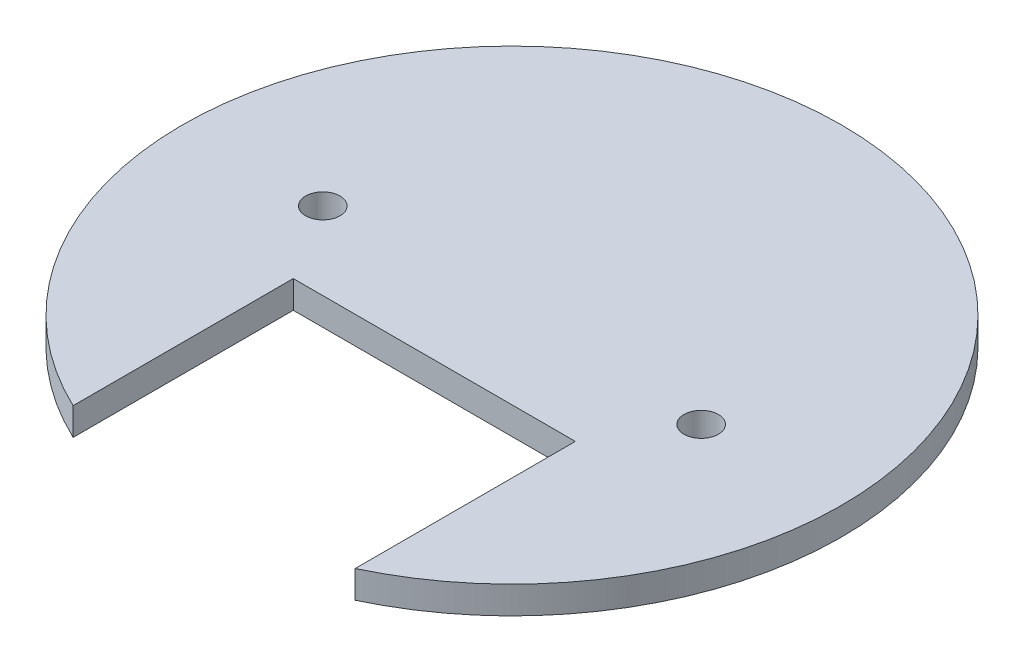
ISO-10303-21;
HEADER;
FILE_DESCRIPTION(('STEP AP214'),'2;1');
FILE_NAME('part.step','',(''),(''),'','','');
FILE_SCHEMA(('AUTOMOTIVE_DESIGN { 1 0 10303 214 1 1 1 1 }'));
ENDSEC;
DATA;
#1=APPLICATION_CONTEXT('core data for automotive mechanical design processes');
#2=APPLICATION_PROTOCOL_DEFINITION('international standard','automotive_design',2000,#1);
#3=PRODUCT_CONTEXT('',#1,'mechanical');
#4=PRODUCT('Part','Part','',(#3));
#5=PRODUCT_RELATED_PRODUCT_CATEGORY('part','',(#4));
#6=PRODUCT_DEFINITION_FORMATION('','',#4);
#7=PRODUCT_DEFINITION_CONTEXT('part definition',#1,'design');
#8=PRODUCT_DEFINITION('design','',#6,#7);
#9=PRODUCT_DEFINITION_SHAPE('','',#8);
#10=(LENGTH_UNIT() NAMED_UNIT(*) SI_UNIT(.MILLI.,.METRE.));
#11=(NAMED_UNIT(*) PLANE_ANGLE_UNIT() SI_UNIT($,.RADIAN.));
#12=(NAMED_UNIT(*) SI_UNIT($,.STERADIAN.) SOLID_ANGLE_UNIT());
#13=UNCERTAINTY_MEASURE_WITH_UNIT(LENGTH_MEASURE(1.E-05),#10,'distance_accuracy_value','');
#14=(GEOMETRIC_REPRESENTATION_CONTEXT(3) GLOBAL_UNCERTAINTY_ASSIGNED_CONTEXT((#13)) GLOBAL_UNIT_ASSIGNED_CONTEXT((#10,
#11,#12)) REPRESENTATION_CONTEXT('',''));
#15=CARTESIAN_POINT('',(0.,0.,0.));
#16=DIRECTION('',(0.,0.,1.));
#17=DIRECTION('',(1.,0.,0.));
#18=AXIS2_PLACEMENT_3D('',#15,#16,#17);
#19=CARTESIAN_POINT('',(0.,4.,0.));
#20=DIRECTION('',(0.,1.,0.));
#21=DIRECTION('',(0.,0.,1.));
#22=AXIS2_PLACEMENT_3D('',#19,#20,#21);
#23=PLANE('',#22);
#24=CARTESIAN_POINT('',(-27.5,4.,0.));
#25=DIRECTION('',(0.,1.,0.));
#26=DIRECTION('',(0.,0.,1.));
#27=AXIS2_PLACEMENT_3D('',#24,#25,#26);
#28=CIRCLE('',#27,2.5);
#29=CARTESIAN_POINT('',(-27.5,4.,2.5));
#30=VERTEX_POINT('',#29);
#31=EDGE_CURVE('E99',#30,#30,#28,.T.);
#32=ORIENTED_EDGE('',*,*,#31,.F.);
#33=EDGE_LOOP('',(#32));
#34=FACE_BOUND('',#33,.T.);
#35=CARTESIAN_POINT('',(0.,4.,0.));
#36=DIRECTION('',(0.,1.,0.));
#37=DIRECTION('',(0.,0.,1.));
#38=AXIS2_PLACEMENT_3D('',#35,#36,#37);
#39=CIRCLE('',#38,47.9);
#40=CARTESIAN_POINT('',(20.5,4.,43.2915696181139));
#41=VERTEX_POINT('',#40);
#42=CARTESIAN_POINT('',(-20.5,4.,43.2915696181139));
#43=VERTEX_POINT('',#42);
#44=EDGE_CURVE('E84',#41,#43,#39,.T.);
#45=ORIENTED_EDGE('',*,*,#44,.T.);
#46=DIRECTION('',(0.,0.,-1.));
#47=VECTOR('',#46,1.);
#48=CARTESIAN_POINT('',(-20.5,4.,43.2915696181139));
#49=LINE('',#48,#47);
#50=CARTESIAN_POINT('',(-20.5,4.,11.2915696181139));
#51=VERTEX_POINT('',#50);
#52=EDGE_CURVE('E79',#43,#51,#49,.T.);
#53=ORIENTED_EDGE('',*,*,#52,.T.);
#54=DIRECTION('',(1.,0.,0.));
#55=VECTOR('',#54,1.);
#56=CARTESIAN_POINT('',(-20.5,4.,11.2915696181139));
#57=LINE('',#56,#55);
#58=CARTESIAN_POINT('',(20.5,4.,11.2915696181139));
#59=VERTEX_POINT('',#58);
#60=EDGE_CURVE('E82',#51,#59,#57,.T.);
#61=ORIENTED_EDGE('',*,*,#60,.T.);
#62=DIRECTION('',(0.,0.,1.));
#63=VECTOR('',#62,1.);
#64=CARTESIAN_POINT('',(20.5,4.,11.2915696181139));
#65=LINE('',#64,#63);
#66=EDGE_CURVE('E49',#59,#41,#65,.T.);
#67=ORIENTED_EDGE('',*,*,#66,.T.);
#68=EDGE_LOOP('',(#45,#53,#61,#67));
#69=FACE_BOUND('',#68,.T.);
#70=CARTESIAN_POINT('',(27.5,4.,0.));
#71=DIRECTION('',(0.,1.,0.));
#72=DIRECTION('',(0.,0.,-1.));
#73=AXIS2_PLACEMENT_3D('',#70,#71,#72);
#74=CIRCLE('',#73,2.5);
#75=CARTESIAN_POINT('',(27.5,4.,-2.50000000000001));
#76=VERTEX_POINT('',#75);
#77=EDGE_CURVE('E114',#76,#76,#74,.T.);
#78=ORIENTED_EDGE('',*,*,#77,.F.);
#79=EDGE_LOOP('',(#78));
#80=FACE_BOUND('',#79,.T.);
#81=ADVANCED_FACE('F32',(#34,#69,#80),#23,.T.);
#82=CARTESIAN_POINT('',(0.,0.,0.));
#83=DIRECTION('',(0.,1.,0.));
#84=DIRECTION('',(0.,0.,1.));
#85=AXIS2_PLACEMENT_3D('',#82,#83,#84);
#86=PLANE('',#85);
#87=CARTESIAN_POINT('',(0.,0.,0.));
#88=DIRECTION('',(0.,1.,0.));
#89=DIRECTION('',(0.,0.,1.));
#90=AXIS2_PLACEMENT_3D('',#87,#88,#89);
#91=CIRCLE('',#90,47.9);
#92=CARTESIAN_POINT('',(20.5,0.,43.2915696181139));
#93=VERTEX_POINT('',#92);
#94=CARTESIAN_POINT('',(-20.5,0.,43.2915696181139));
#95=VERTEX_POINT('',#94);
#96=EDGE_CURVE('E96',#93,#95,#91,.T.);
#97=ORIENTED_EDGE('',*,*,#96,.F.);
#98=DIRECTION('',(0.,0.,1.));
#99=VECTOR('',#98,1.);
#100=CARTESIAN_POINT('',(20.5,0.,11.2915696181139));
#101=LINE('',#100,#99);
#102=CARTESIAN_POINT('',(20.5,0.,11.2915696181139));
#103=VERTEX_POINT('',#102);
#104=EDGE_CURVE('E72',#103,#93,#101,.T.);
#105=ORIENTED_EDGE('',*,*,#104,.F.);
#106=DIRECTION('',(1.,0.,0.));
#107=VECTOR('',#106,1.);
#108=CARTESIAN_POINT('',(-20.5,0.,11.2915696181139));
#109=LINE('',#108,#107);
#110=CARTESIAN_POINT('',(-20.5,0.,11.2915696181139));
#111=VERTEX_POINT('',#110);
#112=EDGE_CURVE('E66',#111,#103,#109,.T.);
#113=ORIENTED_EDGE('',*,*,#112,.F.);
#114=DIRECTION('',(0.,0.,-1.));
#115=VECTOR('',#114,1.);
#116=CARTESIAN_POINT('',(-20.5,0.,43.2915696181139));
#117=LINE('',#116,#115);
#118=EDGE_CURVE('E88',#95,#111,#117,.T.);
#119=ORIENTED_EDGE('',*,*,#118,.F.);
#120=EDGE_LOOP('',(#97,#105,#113,#119));
#121=FACE_BOUND('',#120,.T.);
#122=CARTESIAN_POINT('',(-27.5,0.,0.));
#123=DIRECTION('',(0.,1.,0.));
#124=DIRECTION('',(0.,0.,1.));
#125=AXIS2_PLACEMENT_3D('',#122,#123,#124);
#126=CIRCLE('',#125,2.5);
#127=CARTESIAN_POINT('',(-27.5,0.,2.5));
#128=VERTEX_POINT('',#127);
#129=EDGE_CURVE('E111',#128,#128,#126,.T.);
#130=ORIENTED_EDGE('',*,*,#129,.T.);
#131=EDGE_LOOP('',(#130));
#132=FACE_BOUND('',#131,.T.);
#133=CARTESIAN_POINT('',(27.5,0.,0.));
#134=DIRECTION('',(0.,1.,0.));
#135=DIRECTION('',(0.,0.,-1.));
#136=AXIS2_PLACEMENT_3D('',#133,#134,#135);
#137=CIRCLE('',#136,2.5);
#138=CARTESIAN_POINT('',(27.5,0.,-2.50000000000001));
#139=VERTEX_POINT('',#138);
#140=EDGE_CURVE('E117',#139,#139,#137,.T.);
#141=ORIENTED_EDGE('',*,*,#140,.T.);
#142=EDGE_LOOP('',(#141));
#143=FACE_BOUND('',#142,.T.);
#144=ADVANCED_FACE('F107',(#121,#132,#143),#86,.F.);
#145=CARTESIAN_POINT('',(0.,4.,0.));
#146=DIRECTION('',(0.,-1.,0.));
#147=DIRECTION('',(0.,0.,-1.));
#148=AXIS2_PLACEMENT_3D('',#145,#146,#147);
#149=CYLINDRICAL_SURFACE('',#148,47.9);
#150=ORIENTED_EDGE('',*,*,#96,.T.);
#151=DIRECTION('',(0.,-1.,0.));
#152=VECTOR('',#151,1.);
#153=CARTESIAN_POINT('',(-20.5,4.,43.2915696181139));
#154=LINE('',#153,#152);
#155=EDGE_CURVE('E11',#43,#95,#154,.T.);
#156=ORIENTED_EDGE('',*,*,#155,.F.);
#157=ORIENTED_EDGE('',*,*,#44,.F.);
#158=DIRECTION('',(0.,-1.,0.));
#159=VECTOR('',#158,1.);
#160=CARTESIAN_POINT('',(20.5,4.,43.2915696181139));
#161=LINE('',#160,#159);
#162=EDGE_CURVE('E92',#41,#93,#161,.T.);
#163=ORIENTED_EDGE('',*,*,#162,.T.);
#164=EDGE_LOOP('',(#150,#156,#157,#163));
#165=FACE_BOUND('',#164,.T.);
#166=ADVANCED_FACE('F34',(#165),#149,.T.);
#167=CARTESIAN_POINT('',(-20.5,4.,43.2915696181139));
#168=DIRECTION('',(-1.,0.,0.));
#169=DIRECTION('',(0.,0.,1.));
#170=AXIS2_PLACEMENT_3D('',#167,#168,#169);
#171=PLANE('',#170);
#172=ORIENTED_EDGE('',*,*,#118,.T.);
#173=DIRECTION('',(0.,-1.,0.));
#174=VECTOR('',#173,1.);
#175=CARTESIAN_POINT('',(-20.5,4.,11.2915696181139));
#176=LINE('',#175,#174);
#177=EDGE_CURVE('E41',#51,#111,#176,.T.);
#178=ORIENTED_EDGE('',*,*,#177,.F.);
#179=ORIENTED_EDGE('',*,*,#52,.F.);
#180=ORIENTED_EDGE('',*,*,#155,.T.);
#181=EDGE_LOOP('',(#172,#178,#179,#180));
#182=FACE_BOUND('',#181,.T.);
#183=ADVANCED_FACE('F87',(#182),#171,.F.);
#184=CARTESIAN_POINT('',(-20.5,4.,11.2915696181139));
#185=DIRECTION('',(0.,0.,-1.));
#186=DIRECTION('',(-1.,0.,0.));
#187=AXIS2_PLACEMENT_3D('',#184,#185,#186);
#188=PLANE('',#187);
#189=ORIENTED_EDGE('',*,*,#112,.T.);
#190=DIRECTION('',(0.,-1.,0.));
#191=VECTOR('',#190,1.);
#192=CARTESIAN_POINT('',(20.5,4.,11.2915696181139));
#193=LINE('',#192,#191);
#194=EDGE_CURVE('E89',#59,#103,#193,.T.);
#195=ORIENTED_EDGE('',*,*,#194,.F.);
#196=ORIENTED_EDGE('',*,*,#60,.F.);
#197=ORIENTED_EDGE('',*,*,#177,.T.);
#198=EDGE_LOOP('',(#189,#195,#196,#197));
#199=FACE_BOUND('',#198,.T.);
#200=ADVANCED_FACE('F90',(#199),#188,.F.);
#201=CARTESIAN_POINT('',(20.5,4.,11.2915696181139));
#202=DIRECTION('',(1.,0.,0.));
#203=DIRECTION('',(0.,0.,-1.));
#204=AXIS2_PLACEMENT_3D('',#201,#202,#203);
#205=PLANE('',#204);
#206=ORIENTED_EDGE('',*,*,#104,.T.);
#207=ORIENTED_EDGE('',*,*,#162,.F.);
#208=ORIENTED_EDGE('',*,*,#66,.F.);
#209=ORIENTED_EDGE('',*,*,#194,.T.);
#210=EDGE_LOOP('',(#206,#207,#208,#209));
#211=FACE_BOUND('',#210,.T.);
#212=ADVANCED_FACE('F104',(#211),#205,.F.);
#213=CARTESIAN_POINT('',(-27.5,4.,0.));
#214=DIRECTION('',(0.,-1.,0.));
#215=DIRECTION('',(0.,0.,-1.));
#216=AXIS2_PLACEMENT_3D('',#213,#214,#215);
#217=CYLINDRICAL_SURFACE('',#216,2.5);
#218=ORIENTED_EDGE('',*,*,#31,.T.);
#219=EDGE_LOOP('',(#218));
#220=FACE_BOUND('',#219,.T.);
#221=ORIENTED_EDGE('',*,*,#129,.F.);
#222=EDGE_LOOP('',(#221));
#223=FACE_BOUND('',#222,.T.);
#224=ADVANCED_FACE('F134',(#220,#223),#217,.F.);
#225=CARTESIAN_POINT('',(27.5,4.,0.));
#226=DIRECTION('',(0.,-1.,0.));
#227=DIRECTION('',(0.,0.,-1.));
#228=AXIS2_PLACEMENT_3D('',#225,#226,#227);
#229=CYLINDRICAL_SURFACE('',#228,2.5);
#230=ORIENTED_EDGE('',*,*,#77,.T.);
#231=EDGE_LOOP('',(#230));
#232=FACE_BOUND('',#231,.T.);
#233=ORIENTED_EDGE('',*,*,#140,.F.);
#234=EDGE_LOOP('',(#233));
#235=FACE_BOUND('',#234,.T.);
#236=ADVANCED_FACE('F123',(#232,#235),#229,.F.);
#237=CLOSED_SHELL('',(#81,#144,#166,#183,#200,#212,#224,#236));
#238=MANIFOLD_SOLID_BREP('B2',#237);
#239=ADVANCED_BREP_SHAPE_REPRESENTATION('',(#18,#238),#14);
#240=SHAPE_DEFINITION_REPRESENTATION(#9,#239);
ENDSEC;
END-ISO-10303-21;
